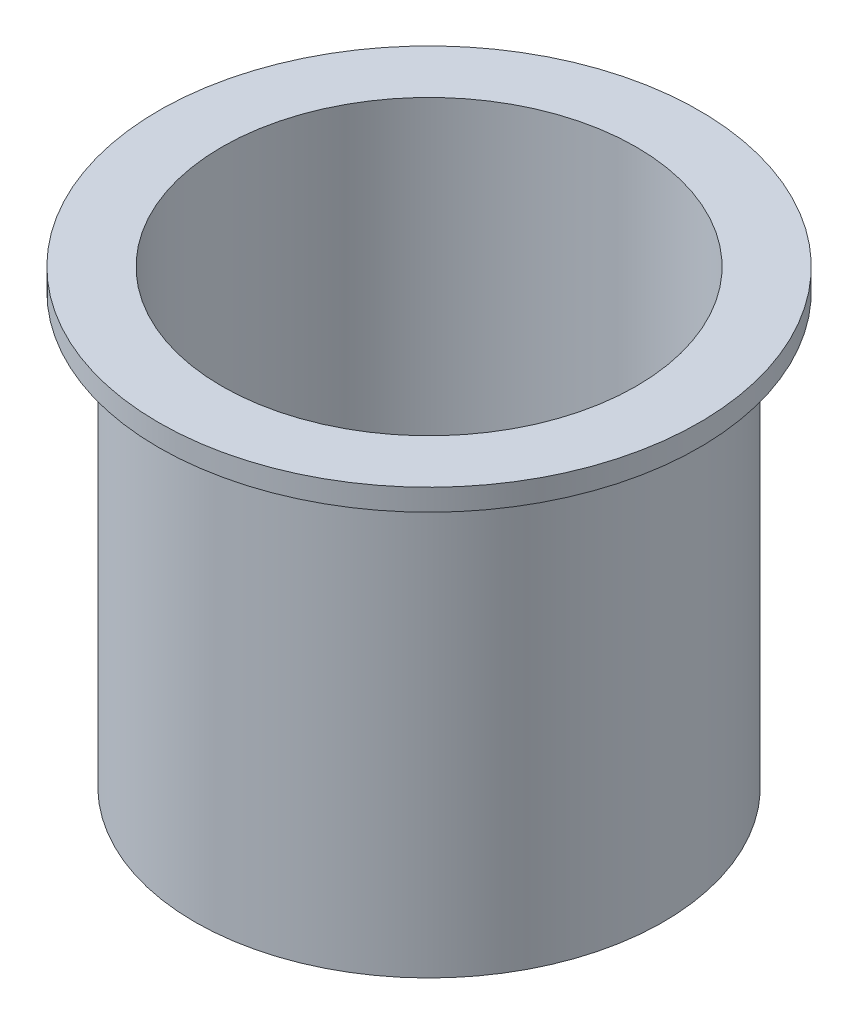
ISO-10303-21;
HEADER;
FILE_DESCRIPTION(('STEP AP214'),'2;1');
FILE_NAME('part.step','',(''),(''),'','','');
FILE_SCHEMA(('AUTOMOTIVE_DESIGN { 1 0 10303 214 1 1 1 1 }'));
ENDSEC;
DATA;
#1=APPLICATION_CONTEXT('core data for automotive mechanical design processes');
#2=APPLICATION_PROTOCOL_DEFINITION('international standard','automotive_design',2000,#1);
#3=PRODUCT_CONTEXT('',#1,'mechanical');
#4=PRODUCT('Part','Part','',(#3));
#5=PRODUCT_RELATED_PRODUCT_CATEGORY('part','',(#4));
#6=PRODUCT_DEFINITION_FORMATION('','',#4);
#7=PRODUCT_DEFINITION_CONTEXT('part definition',#1,'design');
#8=PRODUCT_DEFINITION('design','',#6,#7);
#9=PRODUCT_DEFINITION_SHAPE('','',#8);
#10=(LENGTH_UNIT() NAMED_UNIT(*) SI_UNIT(.MILLI.,.METRE.));
#11=(NAMED_UNIT(*) PLANE_ANGLE_UNIT() SI_UNIT($,.RADIAN.));
#12=(NAMED_UNIT(*) SI_UNIT($,.STERADIAN.) SOLID_ANGLE_UNIT());
#13=UNCERTAINTY_MEASURE_WITH_UNIT(LENGTH_MEASURE(1.E-05),#10,'distance_accuracy_value','');
#14=(GEOMETRIC_REPRESENTATION_CONTEXT(3) GLOBAL_UNCERTAINTY_ASSIGNED_CONTEXT((#13)) GLOBAL_UNIT_ASSIGNED_CONTEXT((#10,
#11,#12)) REPRESENTATION_CONTEXT('',''));
#15=CARTESIAN_POINT('',(0.,0.,0.));
#16=DIRECTION('',(0.,0.,1.));
#17=DIRECTION('',(1.,0.,0.));
#18=AXIS2_PLACEMENT_3D('',#15,#16,#17);
#19=CARTESIAN_POINT('',(0.,250.,0.));
#20=DIRECTION('',(0.,1.,0.));
#21=DIRECTION('',(0.,0.,1.));
#22=AXIS2_PLACEMENT_3D('',#19,#20,#21);
#23=PLANE('',#22);
#24=CARTESIAN_POINT('',(0.,250.,0.));
#25=DIRECTION('',(0.,1.,0.));
#26=DIRECTION('',(0.,0.,1.));
#27=AXIS2_PLACEMENT_3D('',#24,#25,#26);
#28=CIRCLE('',#27,115.);
#29=CARTESIAN_POINT('',(0.,250.,115.));
#30=VERTEX_POINT('',#29);
#31=EDGE_CURVE('E59',#30,#30,#28,.T.);
#32=ORIENTED_EDGE('',*,*,#31,.F.);
#33=EDGE_LOOP('',(#32));
#34=FACE_BOUND('',#33,.T.);
#35=CARTESIAN_POINT('',(0.,250.,0.));
#36=DIRECTION('',(0.,1.,0.));
#37=DIRECTION('',(0.,0.,1.));
#38=AXIS2_PLACEMENT_3D('',#35,#36,#37);
#39=CIRCLE('',#38,150.);
#40=CARTESIAN_POINT('',(0.,250.,150.));
#41=VERTEX_POINT('',#40);
#42=EDGE_CURVE('E58',#41,#41,#39,.T.);
#43=ORIENTED_EDGE('',*,*,#42,.T.);
#44=EDGE_LOOP('',(#43));
#45=FACE_BOUND('',#44,.T.);
#46=ADVANCED_FACE('F41',(#34,#45),#23,.T.);
#47=CARTESIAN_POINT('',(0.,250.,0.));
#48=DIRECTION('',(0.,-1.,0.));
#49=DIRECTION('',(0.,0.,-1.));
#50=AXIS2_PLACEMENT_3D('',#47,#48,#49);
#51=CYLINDRICAL_SURFACE('',#50,115.);
#52=ORIENTED_EDGE('',*,*,#31,.T.);
#53=EDGE_LOOP('',(#52));
#54=FACE_BOUND('',#53,.T.);
#55=CARTESIAN_POINT('',(0.,15.,0.));
#56=DIRECTION('',(0.,1.,0.));
#57=DIRECTION('',(0.,0.,1.));
#58=AXIS2_PLACEMENT_3D('',#55,#56,#57);
#59=CIRCLE('',#58,115.);
#60=CARTESIAN_POINT('',(0.,15.,115.));
#61=VERTEX_POINT('',#60);
#62=EDGE_CURVE('E47',#61,#61,#59,.F.);
#63=ORIENTED_EDGE('',*,*,#62,.T.);
#64=EDGE_LOOP('',(#63));
#65=FACE_BOUND('',#64,.T.);
#66=ADVANCED_FACE('F84',(#54,#65),#51,.F.);
#67=CARTESIAN_POINT('',(0.,15.,0.));
#68=DIRECTION('',(0.,1.,0.));
#69=DIRECTION('',(0.,0.,1.));
#70=AXIS2_PLACEMENT_3D('',#67,#68,#69);
#71=PLANE('',#70);
#72=ORIENTED_EDGE('',*,*,#62,.F.);
#73=EDGE_LOOP('',(#72));
#74=FACE_BOUND('',#73,.T.);
#75=ADVANCED_FACE('F74',(#74),#71,.T.);
#76=CARTESIAN_POINT('',(0.,238.,0.));
#77=DIRECTION('',(0.,1.,0.));
#78=DIRECTION('',(0.,0.,1.));
#79=AXIS2_PLACEMENT_3D('',#76,#77,#78);
#80=PLANE('',#79);
#81=CARTESIAN_POINT('',(0.,238.,0.));
#82=DIRECTION('',(0.,1.,0.));
#83=DIRECTION('',(0.,0.,1.));
#84=AXIS2_PLACEMENT_3D('',#81,#82,#83);
#85=CIRCLE('',#84,150.);
#86=CARTESIAN_POINT('',(0.,238.,150.));
#87=VERTEX_POINT('',#86);
#88=EDGE_CURVE('E57',#87,#87,#85,.T.);
#89=ORIENTED_EDGE('',*,*,#88,.F.);
#90=EDGE_LOOP('',(#89));
#91=FACE_BOUND('',#90,.T.);
#92=CARTESIAN_POINT('',(0.,238.,0.));
#93=DIRECTION('',(0.,1.,0.));
#94=DIRECTION('',(0.,0.,1.));
#95=AXIS2_PLACEMENT_3D('',#92,#93,#94);
#96=CIRCLE('',#95,130.);
#97=CARTESIAN_POINT('',(0.,238.,130.));
#98=VERTEX_POINT('',#97);
#99=EDGE_CURVE('E10',#98,#98,#96,.T.);
#100=ORIENTED_EDGE('',*,*,#99,.T.);
#101=EDGE_LOOP('',(#100));
#102=FACE_BOUND('',#101,.T.);
#103=ADVANCED_FACE('F75',(#91,#102),#80,.F.);
#104=CARTESIAN_POINT('',(0.,250.,0.));
#105=DIRECTION('',(0.,-1.,0.));
#106=DIRECTION('',(0.,0.,-1.));
#107=AXIS2_PLACEMENT_3D('',#104,#105,#106);
#108=CYLINDRICAL_SURFACE('',#107,150.);
#109=ORIENTED_EDGE('',*,*,#42,.F.);
#110=EDGE_LOOP('',(#109));
#111=FACE_BOUND('',#110,.T.);
#112=ORIENTED_EDGE('',*,*,#88,.T.);
#113=EDGE_LOOP('',(#112));
#114=FACE_BOUND('',#113,.T.);
#115=ADVANCED_FACE('F66',(#111,#114),#108,.T.);
#116=CARTESIAN_POINT('',(0.,0.,0.));
#117=DIRECTION('',(0.,1.,0.));
#118=DIRECTION('',(0.,0.,1.));
#119=AXIS2_PLACEMENT_3D('',#116,#117,#118);
#120=PLANE('',#119);
#121=CARTESIAN_POINT('',(0.,0.,0.));
#122=DIRECTION('',(0.,1.,0.));
#123=DIRECTION('',(0.,0.,1.));
#124=AXIS2_PLACEMENT_3D('',#121,#122,#123);
#125=CIRCLE('',#124,130.);
#126=CARTESIAN_POINT('',(0.,0.,130.));
#127=VERTEX_POINT('',#126);
#128=EDGE_CURVE('E44',#127,#127,#125,.T.);
#129=ORIENTED_EDGE('',*,*,#128,.F.);
#130=EDGE_LOOP('',(#129));
#131=FACE_BOUND('',#130,.T.);
#132=ADVANCED_FACE('F78',(#131),#120,.F.);
#133=CARTESIAN_POINT('',(0.,15.,0.));
#134=DIRECTION('',(0.,-1.,0.));
#135=DIRECTION('',(0.,0.,-1.));
#136=AXIS2_PLACEMENT_3D('',#133,#134,#135);
#137=CYLINDRICAL_SURFACE('',#136,130.);
#138=ORIENTED_EDGE('',*,*,#128,.T.);
#139=EDGE_LOOP('',(#138));
#140=FACE_BOUND('',#139,.T.);
#141=ORIENTED_EDGE('',*,*,#99,.F.);
#142=EDGE_LOOP('',(#141));
#143=FACE_BOUND('',#142,.T.);
#144=ADVANCED_FACE('F43',(#140,#143),#137,.T.);
#145=CLOSED_SHELL('',(#46,#66,#75,#103,#115,#132,#144));
#146=MANIFOLD_SOLID_BREP('B2',#145);
#147=ADVANCED_BREP_SHAPE_REPRESENTATION('',(#18,#146),#14);
#148=SHAPE_DEFINITION_REPRESENTATION(#9,#147);
ENDSEC;
END-ISO-10303-21;
